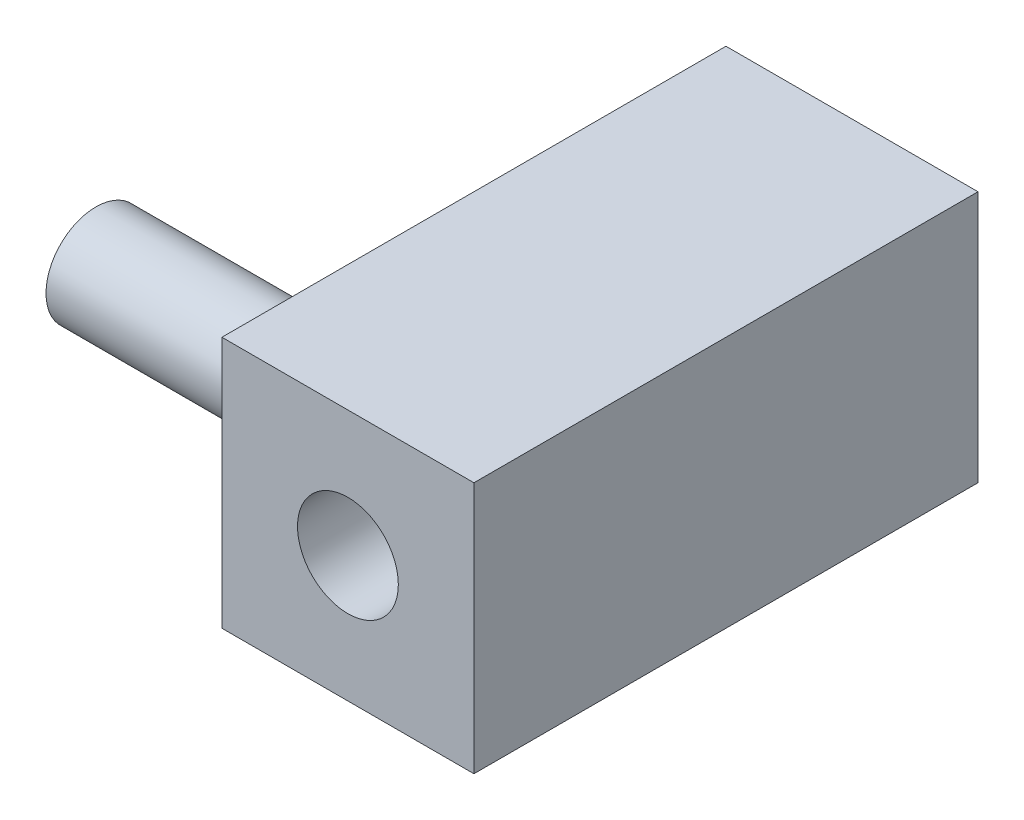
ISO-10303-21;
HEADER;
FILE_DESCRIPTION(('STEP AP214'),'2;1');
FILE_NAME('part.step','',(''),(''),'','','');
FILE_SCHEMA(('AUTOMOTIVE_DESIGN { 1 0 10303 214 1 1 1 1 }'));
ENDSEC;
DATA;
#1=APPLICATION_CONTEXT('core data for automotive mechanical design processes');
#2=APPLICATION_PROTOCOL_DEFINITION('international standard','automotive_design',2000,#1);
#3=PRODUCT_CONTEXT('',#1,'mechanical');
#4=PRODUCT('Part','Part','',(#3));
#5=PRODUCT_RELATED_PRODUCT_CATEGORY('part','',(#4));
#6=PRODUCT_DEFINITION_FORMATION('','',#4);
#7=PRODUCT_DEFINITION_CONTEXT('part definition',#1,'design');
#8=PRODUCT_DEFINITION('design','',#6,#7);
#9=PRODUCT_DEFINITION_SHAPE('','',#8);
#10=(LENGTH_UNIT() NAMED_UNIT(*) SI_UNIT(.MILLI.,.METRE.));
#11=(NAMED_UNIT(*) PLANE_ANGLE_UNIT() SI_UNIT($,.RADIAN.));
#12=(NAMED_UNIT(*) SI_UNIT($,.STERADIAN.) SOLID_ANGLE_UNIT());
#13=UNCERTAINTY_MEASURE_WITH_UNIT(LENGTH_MEASURE(1.E-05),#10,'distance_accuracy_value','');
#14=(GEOMETRIC_REPRESENTATION_CONTEXT(3) GLOBAL_UNCERTAINTY_ASSIGNED_CONTEXT((#13)) GLOBAL_UNIT_ASSIGNED_CONTEXT((#10,
#11,#12)) REPRESENTATION_CONTEXT('',''));
#15=CARTESIAN_POINT('',(0.,0.,0.));
#16=DIRECTION('',(0.,0.,1.));
#17=DIRECTION('',(1.,0.,0.));
#18=AXIS2_PLACEMENT_3D('',#15,#16,#17);
#19=CARTESIAN_POINT('',(0.,0.,100.));
#20=DIRECTION('',(-1.,0.,0.));
#21=DIRECTION('',(0.,-1.,0.));
#22=AXIS2_PLACEMENT_3D('',#19,#20,#21);
#23=PLANE('',#22);
#24=DIRECTION('',(0.,1.,0.));
#25=VECTOR('',#24,1.);
#26=CARTESIAN_POINT('',(0.,0.,0.));
#27=LINE('',#26,#25);
#28=CARTESIAN_POINT('',(0.,0.,0.));
#29=VERTEX_POINT('',#28);
#30=CARTESIAN_POINT('',(0.,50.,0.));
#31=VERTEX_POINT('',#30);
#32=EDGE_CURVE('E101',#29,#31,#27,.T.);
#33=ORIENTED_EDGE('',*,*,#32,.T.);
#34=DIRECTION('',(0.,0.,-1.));
#35=VECTOR('',#34,1.);
#36=CARTESIAN_POINT('',(0.,50.,100.));
#37=LINE('',#36,#35);
#38=CARTESIAN_POINT('',(0.,50.,100.));
#39=VERTEX_POINT('',#38);
#40=EDGE_CURVE('E43',#39,#31,#37,.T.);
#41=ORIENTED_EDGE('',*,*,#40,.F.);
#42=DIRECTION('',(0.,1.,0.));
#43=VECTOR('',#42,1.);
#44=CARTESIAN_POINT('',(0.,0.,100.));
#45=LINE('',#44,#43);
#46=CARTESIAN_POINT('',(0.,0.,100.));
#47=VERTEX_POINT('',#46);
#48=EDGE_CURVE('E87',#47,#39,#45,.T.);
#49=ORIENTED_EDGE('',*,*,#48,.F.);
#50=DIRECTION('',(0.,0.,-1.));
#51=VECTOR('',#50,1.);
#52=CARTESIAN_POINT('',(0.,0.,100.));
#53=LINE('',#52,#51);
#54=EDGE_CURVE('E97',#47,#29,#53,.T.);
#55=ORIENTED_EDGE('',*,*,#54,.T.);
#56=EDGE_LOOP('',(#33,#41,#49,#55));
#57=FACE_BOUND('',#56,.T.);
#58=ADVANCED_FACE('F35',(#57),#23,.F.);
#59=CARTESIAN_POINT('',(0.,50.,100.));
#60=DIRECTION('',(0.,-1.,0.));
#61=DIRECTION('',(1.,0.,0.));
#62=AXIS2_PLACEMENT_3D('',#59,#60,#61);
#63=PLANE('',#62);
#64=DIRECTION('',(-1.,0.,0.));
#65=VECTOR('',#64,1.);
#66=CARTESIAN_POINT('',(0.,50.,0.));
#67=LINE('',#66,#65);
#68=CARTESIAN_POINT('',(-50.,50.,0.));
#69=VERTEX_POINT('',#68);
#70=EDGE_CURVE('E92',#31,#69,#67,.T.);
#71=ORIENTED_EDGE('',*,*,#70,.T.);
#72=DIRECTION('',(0.,0.,-1.));
#73=VECTOR('',#72,1.);
#74=CARTESIAN_POINT('',(-50.,50.,100.));
#75=LINE('',#74,#73);
#76=CARTESIAN_POINT('',(-50.,50.,100.));
#77=VERTEX_POINT('',#76);
#78=EDGE_CURVE('E90',#77,#69,#75,.T.);
#79=ORIENTED_EDGE('',*,*,#78,.F.);
#80=DIRECTION('',(-1.,0.,0.));
#81=VECTOR('',#80,1.);
#82=CARTESIAN_POINT('',(0.,50.,100.));
#83=LINE('',#82,#81);
#84=EDGE_CURVE('E82',#39,#77,#83,.T.);
#85=ORIENTED_EDGE('',*,*,#84,.F.);
#86=ORIENTED_EDGE('',*,*,#40,.T.);
#87=EDGE_LOOP('',(#71,#79,#85,#86));
#88=FACE_BOUND('',#87,.T.);
#89=ADVANCED_FACE('F91',(#88),#63,.F.);
#90=CARTESIAN_POINT('',(-50.,0.,100.));
#91=DIRECTION('',(1.,0.,0.));
#92=DIRECTION('',(0.,0.,-1.));
#93=AXIS2_PLACEMENT_3D('',#90,#91,#92);
#94=PLANE('',#93);
#95=CARTESIAN_POINT('',(-50.,25.,75.));
#96=DIRECTION('',(1.,0.,0.));
#97=DIRECTION('',(0.,0.,-1.));
#98=AXIS2_PLACEMENT_3D('',#95,#96,#97);
#99=CIRCLE('',#98,9.90000000000001);
#100=CARTESIAN_POINT('',(-50.,25.,65.1));
#101=VERTEX_POINT('',#100);
#102=EDGE_CURVE('E11',#101,#101,#99,.F.);
#103=ORIENTED_EDGE('',*,*,#102,.F.);
#104=EDGE_LOOP('',(#103));
#105=FACE_BOUND('',#104,.T.);
#106=DIRECTION('',(0.,-1.,0.));
#107=VECTOR('',#106,1.);
#108=CARTESIAN_POINT('',(-50.,0.,0.));
#109=LINE('',#108,#107);
#110=CARTESIAN_POINT('',(-50.,0.,0.));
#111=VERTEX_POINT('',#110);
#112=EDGE_CURVE('E68',#69,#111,#109,.T.);
#113=ORIENTED_EDGE('',*,*,#112,.T.);
#114=DIRECTION('',(0.,0.,-1.));
#115=VECTOR('',#114,1.);
#116=CARTESIAN_POINT('',(-50.,0.,100.));
#117=LINE('',#116,#115);
#118=CARTESIAN_POINT('',(-50.,0.,100.));
#119=VERTEX_POINT('',#118);
#120=EDGE_CURVE('E93',#119,#111,#117,.T.);
#121=ORIENTED_EDGE('',*,*,#120,.F.);
#122=DIRECTION('',(0.,-1.,0.));
#123=VECTOR('',#122,1.);
#124=CARTESIAN_POINT('',(-50.,0.,100.));
#125=LINE('',#124,#123);
#126=EDGE_CURVE('E85',#77,#119,#125,.T.);
#127=ORIENTED_EDGE('',*,*,#126,.F.);
#128=ORIENTED_EDGE('',*,*,#78,.T.);
#129=EDGE_LOOP('',(#113,#121,#127,#128));
#130=FACE_BOUND('',#129,.T.);
#131=ADVANCED_FACE('F95',(#105,#130),#94,.F.);
#132=CARTESIAN_POINT('',(0.,0.,100.));
#133=DIRECTION('',(0.,1.,0.));
#134=DIRECTION('',(0.,0.,1.));
#135=AXIS2_PLACEMENT_3D('',#132,#133,#134);
#136=PLANE('',#135);
#137=DIRECTION('',(1.,0.,0.));
#138=VECTOR('',#137,1.);
#139=CARTESIAN_POINT('',(0.,0.,0.));
#140=LINE('',#139,#138);
#141=EDGE_CURVE('E74',#111,#29,#140,.T.);
#142=ORIENTED_EDGE('',*,*,#141,.T.);
#143=ORIENTED_EDGE('',*,*,#54,.F.);
#144=DIRECTION('',(1.,0.,0.));
#145=VECTOR('',#144,1.);
#146=CARTESIAN_POINT('',(0.,0.,100.));
#147=LINE('',#146,#145);
#148=EDGE_CURVE('E51',#119,#47,#147,.T.);
#149=ORIENTED_EDGE('',*,*,#148,.F.);
#150=ORIENTED_EDGE('',*,*,#120,.T.);
#151=EDGE_LOOP('',(#142,#143,#149,#150));
#152=FACE_BOUND('',#151,.T.);
#153=ADVANCED_FACE('F123',(#152),#136,.F.);
#154=CARTESIAN_POINT('',(0.,0.,100.));
#155=DIRECTION('',(0.,0.,1.));
#156=DIRECTION('',(1.,0.,0.));
#157=AXIS2_PLACEMENT_3D('',#154,#155,#156);
#158=PLANE('',#157);
#159=CARTESIAN_POINT('',(-25.,25.,100.));
#160=DIRECTION('',(0.,0.,1.));
#161=DIRECTION('',(1.,0.,0.));
#162=AXIS2_PLACEMENT_3D('',#159,#160,#161);
#163=CIRCLE('',#162,10.);
#164=CARTESIAN_POINT('',(-15.,25.,100.));
#165=VERTEX_POINT('',#164);
#166=EDGE_CURVE('E183',#165,#165,#163,.T.);
#167=ORIENTED_EDGE('',*,*,#166,.F.);
#168=EDGE_LOOP('',(#167));
#169=FACE_BOUND('',#168,.T.);
#170=ORIENTED_EDGE('',*,*,#48,.T.);
#171=ORIENTED_EDGE('',*,*,#84,.T.);
#172=ORIENTED_EDGE('',*,*,#126,.T.);
#173=ORIENTED_EDGE('',*,*,#148,.T.);
#174=EDGE_LOOP('',(#170,#171,#172,#173));
#175=FACE_BOUND('',#174,.T.);
#176=ADVANCED_FACE('F83',(#169,#175),#158,.T.);
#177=CARTESIAN_POINT('',(0.,0.,0.));
#178=DIRECTION('',(0.,0.,1.));
#179=DIRECTION('',(1.,0.,0.));
#180=AXIS2_PLACEMENT_3D('',#177,#178,#179);
#181=PLANE('',#180);
#182=ORIENTED_EDGE('',*,*,#32,.F.);
#183=ORIENTED_EDGE('',*,*,#141,.F.);
#184=ORIENTED_EDGE('',*,*,#112,.F.);
#185=ORIENTED_EDGE('',*,*,#70,.F.);
#186=EDGE_LOOP('',(#182,#183,#184,#185));
#187=FACE_BOUND('',#186,.T.);
#188=ADVANCED_FACE('F112',(#187),#181,.F.);
#189=CARTESIAN_POINT('',(-100.,25.,75.));
#190=DIRECTION('',(1.,0.,0.));
#191=DIRECTION('',(0.,0.,-1.));
#192=AXIS2_PLACEMENT_3D('',#189,#190,#191);
#193=CYLINDRICAL_SURFACE('',#192,9.90000000000001);
#194=CARTESIAN_POINT('',(-100.,25.,75.));
#195=DIRECTION('',(-1.,0.,0.));
#196=DIRECTION('',(0.,0.,1.));
#197=AXIS2_PLACEMENT_3D('',#194,#195,#196);
#198=CIRCLE('',#197,9.90000000000001);
#199=CARTESIAN_POINT('',(-100.,25.,84.9));
#200=VERTEX_POINT('',#199);
#201=EDGE_CURVE('E104',#200,#200,#198,.T.);
#202=ORIENTED_EDGE('',*,*,#201,.F.);
#203=EDGE_LOOP('',(#202));
#204=FACE_BOUND('',#203,.T.);
#205=ORIENTED_EDGE('',*,*,#102,.T.);
#206=EDGE_LOOP('',(#205));
#207=FACE_BOUND('',#206,.T.);
#208=ADVANCED_FACE('F114',(#204,#207),#193,.T.);
#209=CARTESIAN_POINT('',(-100.,25.,75.));
#210=DIRECTION('',(-1.,0.,0.));
#211=DIRECTION('',(0.,0.,1.));
#212=AXIS2_PLACEMENT_3D('',#209,#210,#211);
#213=PLANE('',#212);
#214=ORIENTED_EDGE('',*,*,#201,.T.);
#215=EDGE_LOOP('',(#214));
#216=FACE_BOUND('',#215,.T.);
#217=ADVANCED_FACE('F120',(#216),#213,.T.);
#218=CARTESIAN_POINT('',(-25.,25.,50.));
#219=DIRECTION('',(0.,0.,1.));
#220=DIRECTION('',(1.,0.,0.));
#221=AXIS2_PLACEMENT_3D('',#218,#219,#220);
#222=CYLINDRICAL_SURFACE('',#221,10.);
#223=CARTESIAN_POINT('',(-25.,25.,50.));
#224=DIRECTION('',(0.,0.,1.));
#225=DIRECTION('',(1.,0.,0.));
#226=AXIS2_PLACEMENT_3D('',#223,#224,#225);
#227=CIRCLE('',#226,10.);
#228=CARTESIAN_POINT('',(-15.,25.,50.));
#229=VERTEX_POINT('',#228);
#230=EDGE_CURVE('E181',#229,#229,#227,.T.);
#231=ORIENTED_EDGE('',*,*,#230,.F.);
#232=EDGE_LOOP('',(#231));
#233=FACE_BOUND('',#232,.T.);
#234=ORIENTED_EDGE('',*,*,#166,.T.);
#235=EDGE_LOOP('',(#234));
#236=FACE_BOUND('',#235,.T.);
#237=ADVANCED_FACE('F156',(#233,#236),#222,.F.);
#238=CARTESIAN_POINT('',(-25.,25.,50.));
#239=DIRECTION('',(0.,0.,1.));
#240=DIRECTION('',(1.,0.,0.));
#241=AXIS2_PLACEMENT_3D('',#238,#239,#240);
#242=PLANE('',#241);
#243=ORIENTED_EDGE('',*,*,#230,.T.);
#244=EDGE_LOOP('',(#243));
#245=FACE_BOUND('',#244,.T.);
#246=ADVANCED_FACE('F161',(#245),#242,.T.);
#247=CLOSED_SHELL('',(#58,#89,#131,#153,#176,#188,#208,#217,#237,#246));
#248=MANIFOLD_SOLID_BREP('B2',#247);
#249=ADVANCED_BREP_SHAPE_REPRESENTATION('',(#18,#248),#14);
#250=SHAPE_DEFINITION_REPRESENTATION(#9,#249);
ENDSEC;
END-ISO-10303-21;
